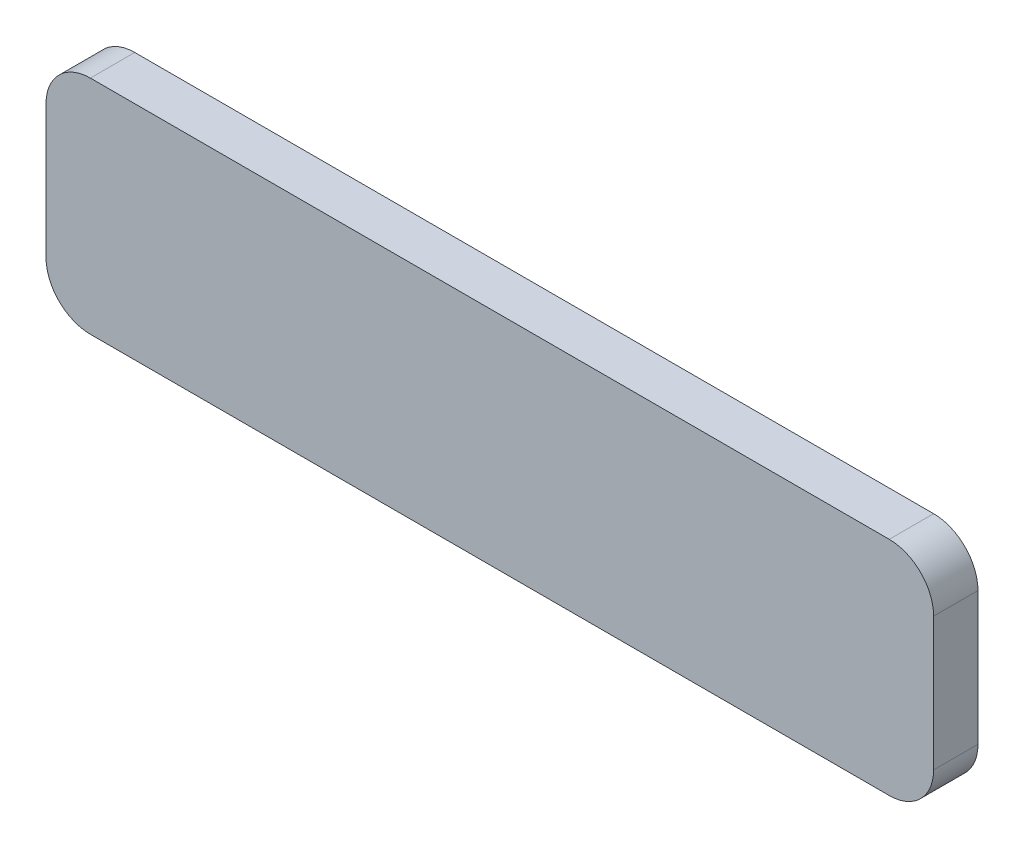
ISO-10303-21;
HEADER;
FILE_DESCRIPTION(('STEP AP214'),'2;1');
FILE_NAME('part.step','',(''),(''),'','','');
FILE_SCHEMA(('AUTOMOTIVE_DESIGN { 1 0 10303 214 1 1 1 1 }'));
ENDSEC;
DATA;
#1=APPLICATION_CONTEXT('core data for automotive mechanical design processes');
#2=APPLICATION_PROTOCOL_DEFINITION('international standard','automotive_design',2000,#1);
#3=PRODUCT_CONTEXT('',#1,'mechanical');
#4=PRODUCT('Part','Part','',(#3));
#5=PRODUCT_RELATED_PRODUCT_CATEGORY('part','',(#4));
#6=PRODUCT_DEFINITION_FORMATION('','',#4);
#7=PRODUCT_DEFINITION_CONTEXT('part definition',#1,'design');
#8=PRODUCT_DEFINITION('design','',#6,#7);
#9=PRODUCT_DEFINITION_SHAPE('','',#8);
#10=(LENGTH_UNIT() NAMED_UNIT(*) SI_UNIT(.MILLI.,.METRE.));
#11=(NAMED_UNIT(*) PLANE_ANGLE_UNIT() SI_UNIT($,.RADIAN.));
#12=(NAMED_UNIT(*) SI_UNIT($,.STERADIAN.) SOLID_ANGLE_UNIT());
#13=UNCERTAINTY_MEASURE_WITH_UNIT(LENGTH_MEASURE(1.E-05),#10,'distance_accuracy_value','');
#14=(GEOMETRIC_REPRESENTATION_CONTEXT(3) GLOBAL_UNCERTAINTY_ASSIGNED_CONTEXT((#13)) GLOBAL_UNIT_ASSIGNED_CONTEXT((#10,
#11,#12)) REPRESENTATION_CONTEXT('',''));
#15=CARTESIAN_POINT('',(0.,0.,0.));
#16=DIRECTION('',(0.,0.,1.));
#17=DIRECTION('',(1.,0.,0.));
#18=AXIS2_PLACEMENT_3D('',#15,#16,#17);
#19=CARTESIAN_POINT('',(-10.,2.5,1.));
#20=DIRECTION('',(1.,0.,0.));
#21=DIRECTION('',(0.,0.,-1.));
#22=AXIS2_PLACEMENT_3D('',#19,#20,#21);
#23=PLANE('',#22);
#24=DIRECTION('',(0.,-1.,0.));
#25=VECTOR('',#24,1.);
#26=CARTESIAN_POINT('',(-10.,2.5,0.));
#27=LINE('',#26,#25);
#28=CARTESIAN_POINT('',(-10.,1.5,0.));
#29=VERTEX_POINT('',#28);
#30=CARTESIAN_POINT('',(-10.,-1.5,0.));
#31=VERTEX_POINT('',#30);
#32=EDGE_CURVE('E126',#29,#31,#27,.T.);
#33=ORIENTED_EDGE('',*,*,#32,.T.);
#34=DIRECTION('',(0.,0.,-1.));
#35=VECTOR('',#34,1.);
#36=CARTESIAN_POINT('',(-10.,-1.5,1.));
#37=LINE('',#36,#35);
#38=CARTESIAN_POINT('',(-10.,-1.5,1.));
#39=VERTEX_POINT('',#38);
#40=EDGE_CURVE('E104',#31,#39,#37,.F.);
#41=ORIENTED_EDGE('',*,*,#40,.T.);
#42=DIRECTION('',(0.,-1.,0.));
#43=VECTOR('',#42,1.);
#44=CARTESIAN_POINT('',(-10.,2.5,1.));
#45=LINE('',#44,#43);
#46=CARTESIAN_POINT('',(-10.,1.5,1.));
#47=VERTEX_POINT('',#46);
#48=EDGE_CURVE('E135',#47,#39,#45,.T.);
#49=ORIENTED_EDGE('',*,*,#48,.F.);
#50=DIRECTION('',(0.,0.,-1.));
#51=VECTOR('',#50,1.);
#52=CARTESIAN_POINT('',(-10.,1.5,1.));
#53=LINE('',#52,#51);
#54=EDGE_CURVE('E109',#47,#29,#53,.T.);
#55=ORIENTED_EDGE('',*,*,#54,.T.);
#56=EDGE_LOOP('',(#33,#41,#49,#55));
#57=FACE_BOUND('',#56,.T.);
#58=ADVANCED_FACE('F33',(#57),#23,.F.);
#59=CARTESIAN_POINT('',(-10.,-2.5,1.));
#60=DIRECTION('',(0.,1.,0.));
#61=DIRECTION('',(-1.,0.,0.));
#62=AXIS2_PLACEMENT_3D('',#59,#60,#61);
#63=PLANE('',#62);
#64=DIRECTION('',(1.,0.,0.));
#65=VECTOR('',#64,1.);
#66=CARTESIAN_POINT('',(-10.,-2.5,1.));
#67=LINE('',#66,#65);
#68=CARTESIAN_POINT('',(-9.,-2.5,1.));
#69=VERTEX_POINT('',#68);
#70=CARTESIAN_POINT('',(9.,-2.5,1.));
#71=VERTEX_POINT('',#70);
#72=EDGE_CURVE('E119',#69,#71,#67,.T.);
#73=ORIENTED_EDGE('',*,*,#72,.F.);
#74=DIRECTION('',(0.,0.,-1.));
#75=VECTOR('',#74,1.);
#76=CARTESIAN_POINT('',(-9.,-2.5,1.));
#77=LINE('',#76,#75);
#78=CARTESIAN_POINT('',(-9.,-2.5,0.));
#79=VERTEX_POINT('',#78);
#80=EDGE_CURVE('E103',#69,#79,#77,.T.);
#81=ORIENTED_EDGE('',*,*,#80,.T.);
#82=DIRECTION('',(1.,0.,0.));
#83=VECTOR('',#82,1.);
#84=CARTESIAN_POINT('',(-10.,-2.5,0.));
#85=LINE('',#84,#83);
#86=CARTESIAN_POINT('',(9.,-2.5,0.));
#87=VERTEX_POINT('',#86);
#88=EDGE_CURVE('E116',#79,#87,#85,.T.);
#89=ORIENTED_EDGE('',*,*,#88,.T.);
#90=DIRECTION('',(0.,0.,-1.));
#91=VECTOR('',#90,1.);
#92=CARTESIAN_POINT('',(9.,-2.5,1.));
#93=LINE('',#92,#91);
#94=EDGE_CURVE('E121',#87,#71,#93,.F.);
#95=ORIENTED_EDGE('',*,*,#94,.T.);
#96=EDGE_LOOP('',(#73,#81,#89,#95));
#97=FACE_BOUND('',#96,.T.);
#98=ADVANCED_FACE('F115',(#97),#63,.F.);
#99=CARTESIAN_POINT('',(10.,2.5,1.));
#100=DIRECTION('',(-1.,0.,0.));
#101=DIRECTION('',(0.,0.,1.));
#102=AXIS2_PLACEMENT_3D('',#99,#100,#101);
#103=PLANE('',#102);
#104=DIRECTION('',(0.,1.,0.));
#105=VECTOR('',#104,1.);
#106=CARTESIAN_POINT('',(10.,2.5,1.));
#107=LINE('',#106,#105);
#108=CARTESIAN_POINT('',(10.,-1.5,1.));
#109=VERTEX_POINT('',#108);
#110=CARTESIAN_POINT('',(10.,1.5,1.));
#111=VERTEX_POINT('',#110);
#112=EDGE_CURVE('E161',#109,#111,#107,.T.);
#113=ORIENTED_EDGE('',*,*,#112,.F.);
#114=DIRECTION('',(0.,0.,-1.));
#115=VECTOR('',#114,1.);
#116=CARTESIAN_POINT('',(10.,-1.5,1.));
#117=LINE('',#116,#115);
#118=CARTESIAN_POINT('',(10.,-1.5,0.));
#119=VERTEX_POINT('',#118);
#120=EDGE_CURVE('E154',#109,#119,#117,.T.);
#121=ORIENTED_EDGE('',*,*,#120,.T.);
#122=DIRECTION('',(0.,1.,0.));
#123=VECTOR('',#122,1.);
#124=CARTESIAN_POINT('',(10.,2.5,0.));
#125=LINE('',#124,#123);
#126=CARTESIAN_POINT('',(10.,1.5,0.));
#127=VERTEX_POINT('',#126);
#128=EDGE_CURVE('E125',#119,#127,#125,.T.);
#129=ORIENTED_EDGE('',*,*,#128,.T.);
#130=DIRECTION('',(0.,0.,-1.));
#131=VECTOR('',#130,1.);
#132=CARTESIAN_POINT('',(10.,1.5,1.));
#133=LINE('',#132,#131);
#134=EDGE_CURVE('E152',#127,#111,#133,.F.);
#135=ORIENTED_EDGE('',*,*,#134,.T.);
#136=EDGE_LOOP('',(#113,#121,#129,#135));
#137=FACE_BOUND('',#136,.T.);
#138=ADVANCED_FACE('F159',(#137),#103,.F.);
#139=CARTESIAN_POINT('',(-10.,2.5,1.));
#140=DIRECTION('',(0.,-1.,0.));
#141=DIRECTION('',(1.,0.,0.));
#142=AXIS2_PLACEMENT_3D('',#139,#140,#141);
#143=PLANE('',#142);
#144=DIRECTION('',(-1.,0.,0.));
#145=VECTOR('',#144,1.);
#146=CARTESIAN_POINT('',(-10.,2.5,1.));
#147=LINE('',#146,#145);
#148=CARTESIAN_POINT('',(9.,2.5,1.));
#149=VERTEX_POINT('',#148);
#150=CARTESIAN_POINT('',(-9.,2.5,1.));
#151=VERTEX_POINT('',#150);
#152=EDGE_CURVE('E136',#149,#151,#147,.T.);
#153=ORIENTED_EDGE('',*,*,#152,.F.);
#154=DIRECTION('',(0.,0.,-1.));
#155=VECTOR('',#154,1.);
#156=CARTESIAN_POINT('',(9.,2.5,1.));
#157=LINE('',#156,#155);
#158=CARTESIAN_POINT('',(9.,2.5,0.));
#159=VERTEX_POINT('',#158);
#160=EDGE_CURVE('E11',#149,#159,#157,.T.);
#161=ORIENTED_EDGE('',*,*,#160,.T.);
#162=DIRECTION('',(-1.,0.,0.));
#163=VECTOR('',#162,1.);
#164=CARTESIAN_POINT('',(-10.,2.5,0.));
#165=LINE('',#164,#163);
#166=CARTESIAN_POINT('',(-9.,2.5,0.));
#167=VERTEX_POINT('',#166);
#168=EDGE_CURVE('E129',#159,#167,#165,.T.);
#169=ORIENTED_EDGE('',*,*,#168,.T.);
#170=DIRECTION('',(0.,0.,-1.));
#171=VECTOR('',#170,1.);
#172=CARTESIAN_POINT('',(-9.,2.5,1.));
#173=LINE('',#172,#171);
#174=EDGE_CURVE('E41',#167,#151,#173,.F.);
#175=ORIENTED_EDGE('',*,*,#174,.T.);
#176=EDGE_LOOP('',(#153,#161,#169,#175));
#177=FACE_BOUND('',#176,.T.);
#178=ADVANCED_FACE('F168',(#177),#143,.F.);
#179=CARTESIAN_POINT('',(0.,0.,1.));
#180=DIRECTION('',(0.,0.,1.));
#181=DIRECTION('',(1.,0.,0.));
#182=AXIS2_PLACEMENT_3D('',#179,#180,#181);
#183=PLANE('',#182);
#184=ORIENTED_EDGE('',*,*,#48,.T.);
#185=CARTESIAN_POINT('',(-9.,-1.5,1.));
#186=DIRECTION('',(0.,0.,1.));
#187=DIRECTION('',(1.,0.,0.));
#188=AXIS2_PLACEMENT_3D('',#185,#186,#187);
#189=CIRCLE('',#188,1.);
#190=EDGE_CURVE('E150',#39,#69,#189,.T.);
#191=ORIENTED_EDGE('',*,*,#190,.T.);
#192=ORIENTED_EDGE('',*,*,#72,.T.);
#193=CARTESIAN_POINT('',(9.,-1.5,1.));
#194=DIRECTION('',(0.,0.,1.));
#195=DIRECTION('',(1.,0.,0.));
#196=AXIS2_PLACEMENT_3D('',#193,#194,#195);
#197=CIRCLE('',#196,1.);
#198=EDGE_CURVE('E148',#71,#109,#197,.T.);
#199=ORIENTED_EDGE('',*,*,#198,.T.);
#200=ORIENTED_EDGE('',*,*,#112,.T.);
#201=CARTESIAN_POINT('',(9.,1.5,1.));
#202=DIRECTION('',(0.,0.,1.));
#203=DIRECTION('',(1.,0.,0.));
#204=AXIS2_PLACEMENT_3D('',#201,#202,#203);
#205=CIRCLE('',#204,1.);
#206=EDGE_CURVE('E54',#111,#149,#205,.T.);
#207=ORIENTED_EDGE('',*,*,#206,.T.);
#208=ORIENTED_EDGE('',*,*,#152,.T.);
#209=CARTESIAN_POINT('',(-9.,1.5,1.));
#210=DIRECTION('',(0.,0.,1.));
#211=DIRECTION('',(1.,0.,0.));
#212=AXIS2_PLACEMENT_3D('',#209,#210,#211);
#213=CIRCLE('',#212,1.);
#214=EDGE_CURVE('E145',#151,#47,#213,.T.);
#215=ORIENTED_EDGE('',*,*,#214,.T.);
#216=EDGE_LOOP('',(#184,#191,#192,#199,#200,#207,#208,#215));
#217=FACE_BOUND('',#216,.T.);
#218=ADVANCED_FACE('F175',(#217),#183,.T.);
#219=CARTESIAN_POINT('',(0.,0.,0.));
#220=DIRECTION('',(0.,0.,1.));
#221=DIRECTION('',(1.,0.,0.));
#222=AXIS2_PLACEMENT_3D('',#219,#220,#221);
#223=PLANE('',#222);
#224=ORIENTED_EDGE('',*,*,#88,.F.);
#225=CARTESIAN_POINT('',(-9.,-1.5,0.));
#226=DIRECTION('',(0.,0.,1.));
#227=DIRECTION('',(1.,0.,0.));
#228=AXIS2_PLACEMENT_3D('',#225,#226,#227);
#229=CIRCLE('',#228,1.);
#230=EDGE_CURVE('E99',#79,#31,#229,.F.);
#231=ORIENTED_EDGE('',*,*,#230,.T.);
#232=ORIENTED_EDGE('',*,*,#32,.F.);
#233=CARTESIAN_POINT('',(-9.,1.5,0.));
#234=DIRECTION('',(0.,0.,1.));
#235=DIRECTION('',(1.,0.,0.));
#236=AXIS2_PLACEMENT_3D('',#233,#234,#235);
#237=CIRCLE('',#236,1.);
#238=EDGE_CURVE('E120',#29,#167,#237,.F.);
#239=ORIENTED_EDGE('',*,*,#238,.T.);
#240=ORIENTED_EDGE('',*,*,#168,.F.);
#241=CARTESIAN_POINT('',(9.,1.5,0.));
#242=DIRECTION('',(0.,0.,1.));
#243=DIRECTION('',(1.,0.,0.));
#244=AXIS2_PLACEMENT_3D('',#241,#242,#243);
#245=CIRCLE('',#244,1.);
#246=EDGE_CURVE('E139',#159,#127,#245,.F.);
#247=ORIENTED_EDGE('',*,*,#246,.T.);
#248=ORIENTED_EDGE('',*,*,#128,.F.);
#249=CARTESIAN_POINT('',(9.,-1.5,0.));
#250=DIRECTION('',(0.,0.,1.));
#251=DIRECTION('',(1.,0.,0.));
#252=AXIS2_PLACEMENT_3D('',#249,#250,#251);
#253=CIRCLE('',#252,1.);
#254=EDGE_CURVE('E110',#119,#87,#253,.F.);
#255=ORIENTED_EDGE('',*,*,#254,.T.);
#256=EDGE_LOOP('',(#224,#231,#232,#239,#240,#247,#248,#255));
#257=FACE_BOUND('',#256,.T.);
#258=ADVANCED_FACE('F123',(#257),#223,.F.);
#259=CARTESIAN_POINT('',(-9.,-1.5,1.));
#260=DIRECTION('',(0.,0.,-1.));
#261=DIRECTION('',(-1.,0.,0.));
#262=AXIS2_PLACEMENT_3D('',#259,#260,#261);
#263=CYLINDRICAL_SURFACE('',#262,1.);
#264=ORIENTED_EDGE('',*,*,#190,.F.);
#265=ORIENTED_EDGE('',*,*,#40,.F.);
#266=ORIENTED_EDGE('',*,*,#230,.F.);
#267=ORIENTED_EDGE('',*,*,#80,.F.);
#268=EDGE_LOOP('',(#264,#265,#266,#267));
#269=FACE_BOUND('',#268,.T.);
#270=ADVANCED_FACE('F102',(#269),#263,.T.);
#271=CARTESIAN_POINT('',(9.,-1.5,1.));
#272=DIRECTION('',(0.,0.,-1.));
#273=DIRECTION('',(-1.,0.,0.));
#274=AXIS2_PLACEMENT_3D('',#271,#272,#273);
#275=CYLINDRICAL_SURFACE('',#274,1.);
#276=ORIENTED_EDGE('',*,*,#198,.F.);
#277=ORIENTED_EDGE('',*,*,#94,.F.);
#278=ORIENTED_EDGE('',*,*,#254,.F.);
#279=ORIENTED_EDGE('',*,*,#120,.F.);
#280=EDGE_LOOP('',(#276,#277,#278,#279));
#281=FACE_BOUND('',#280,.T.);
#282=ADVANCED_FACE('F183',(#281),#275,.T.);
#283=CARTESIAN_POINT('',(9.,1.5,1.));
#284=DIRECTION('',(0.,0.,-1.));
#285=DIRECTION('',(-1.,0.,0.));
#286=AXIS2_PLACEMENT_3D('',#283,#284,#285);
#287=CYLINDRICAL_SURFACE('',#286,1.);
#288=ORIENTED_EDGE('',*,*,#206,.F.);
#289=ORIENTED_EDGE('',*,*,#134,.F.);
#290=ORIENTED_EDGE('',*,*,#246,.F.);
#291=ORIENTED_EDGE('',*,*,#160,.F.);
#292=EDGE_LOOP('',(#288,#289,#290,#291));
#293=FACE_BOUND('',#292,.T.);
#294=ADVANCED_FACE('F167',(#293),#287,.T.);
#295=CARTESIAN_POINT('',(-9.,1.5,1.));
#296=DIRECTION('',(0.,0.,-1.));
#297=DIRECTION('',(-1.,0.,0.));
#298=AXIS2_PLACEMENT_3D('',#295,#296,#297);
#299=CYLINDRICAL_SURFACE('',#298,1.);
#300=ORIENTED_EDGE('',*,*,#214,.F.);
#301=ORIENTED_EDGE('',*,*,#174,.F.);
#302=ORIENTED_EDGE('',*,*,#238,.F.);
#303=ORIENTED_EDGE('',*,*,#54,.F.);
#304=EDGE_LOOP('',(#300,#301,#302,#303));
#305=FACE_BOUND('',#304,.T.);
#306=ADVANCED_FACE('F35',(#305),#299,.T.);
#307=CLOSED_SHELL('',(#58,#98,#138,#178,#218,#258,#270,#282,#294,#306));
#308=MANIFOLD_SOLID_BREP('B2',#307);
#309=ADVANCED_BREP_SHAPE_REPRESENTATION('',(#18,#308),#14);
#310=SHAPE_DEFINITION_REPRESENTATION(#9,#309);
ENDSEC;
END-ISO-10303-21;
